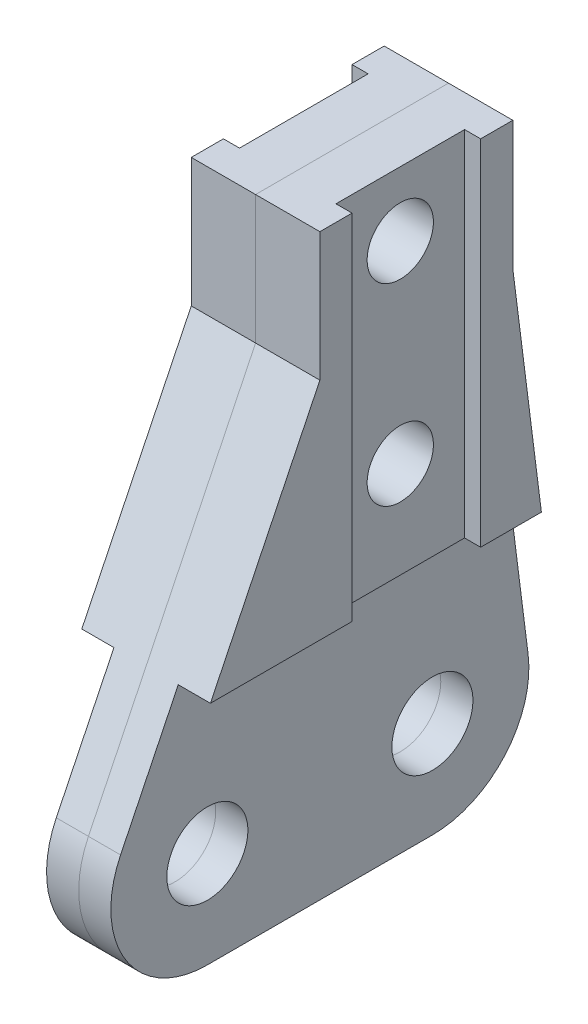
ISO-10303-21;
HEADER;
FILE_DESCRIPTION(('STEP AP214'),'2;1');
FILE_NAME('part.step','',(''),(''),'','','');
FILE_SCHEMA(('AUTOMOTIVE_DESIGN { 1 0 10303 214 1 1 1 1 }'));
ENDSEC;
DATA;
#1=APPLICATION_CONTEXT('core data for automotive mechanical design processes');
#2=APPLICATION_PROTOCOL_DEFINITION('international standard','automotive_design',2000,#1);
#3=PRODUCT_CONTEXT('',#1,'mechanical');
#4=PRODUCT('Part','Part','',(#3));
#5=PRODUCT_RELATED_PRODUCT_CATEGORY('part','',(#4));
#6=PRODUCT_DEFINITION_FORMATION('','',#4);
#7=PRODUCT_DEFINITION_CONTEXT('part definition',#1,'design');
#8=PRODUCT_DEFINITION('design','',#6,#7);
#9=PRODUCT_DEFINITION_SHAPE('','',#8);
#10=(LENGTH_UNIT() NAMED_UNIT(*) SI_UNIT(.MILLI.,.METRE.));
#11=(NAMED_UNIT(*) PLANE_ANGLE_UNIT() SI_UNIT($,.RADIAN.));
#12=(NAMED_UNIT(*) SI_UNIT($,.STERADIAN.) SOLID_ANGLE_UNIT());
#13=UNCERTAINTY_MEASURE_WITH_UNIT(LENGTH_MEASURE(1.E-05),#10,'distance_accuracy_value','');
#14=(GEOMETRIC_REPRESENTATION_CONTEXT(3) GLOBAL_UNCERTAINTY_ASSIGNED_CONTEXT((#13)) GLOBAL_UNIT_ASSIGNED_CONTEXT((#10,
#11,#12)) REPRESENTATION_CONTEXT('',''));
#15=CARTESIAN_POINT('',(0.,0.,0.));
#16=DIRECTION('',(0.,0.,1.));
#17=DIRECTION('',(1.,0.,0.));
#18=AXIS2_PLACEMENT_3D('',#15,#16,#17);
#19=CARTESIAN_POINT('',(-12.7,0.,0.));
#20=DIRECTION('',(-1.,0.,0.));
#21=DIRECTION('',(0.,0.,-1.));
#22=AXIS2_PLACEMENT_3D('',#19,#20,#21);
#23=PLANE('',#22);
#24=DIRECTION('',(0.,-1.,0.));
#25=VECTOR('',#24,1.);
#26=CARTESIAN_POINT('',(-12.7,0.,0.));
#27=LINE('',#26,#25);
#28=CARTESIAN_POINT('',(-12.7,60.3249999999986,0.));
#29=VERTEX_POINT('',#28);
#30=CARTESIAN_POINT('',(-12.7,-9.52500000000001,0.));
#31=VERTEX_POINT('',#30);
#32=EDGE_CURVE('E179',#29,#31,#27,.T.);
#33=ORIENTED_EDGE('',*,*,#32,.T.);
#34=DIRECTION('',(0.,0.,-1.));
#35=VECTOR('',#34,1.);
#36=CARTESIAN_POINT('',(-12.7,-9.52500000000001,0.));
#37=LINE('',#36,#35);
#38=CARTESIAN_POINT('',(-12.7,-9.52500000000001,27.9673826489299));
#39=VERTEX_POINT('',#38);
#40=EDGE_CURVE('E12',#39,#31,#37,.T.);
#41=ORIENTED_EDGE('',*,*,#40,.F.);
#42=DIRECTION('',(0.,-0.899290328705867,0.437352151813722));
#43=VECTOR('',#42,1.);
#44=CARTESIAN_POINT('',(-12.7,9.17784255482599,18.8716232759169));
#45=LINE('',#44,#43);
#46=CARTESIAN_POINT('',(-12.7,34.9249999999986,6.34999999999709));
#47=VERTEX_POINT('',#46);
#48=EDGE_CURVE('E224',#47,#39,#45,.T.);
#49=ORIENTED_EDGE('',*,*,#48,.F.);
#50=DIRECTION('',(0.,-1.,0.));
#51=VECTOR('',#50,1.);
#52=CARTESIAN_POINT('',(-12.7,0.,6.34999999999709));
#53=LINE('',#52,#51);
#54=CARTESIAN_POINT('',(-12.7,60.3249999999986,6.3499999999971));
#55=VERTEX_POINT('',#54);
#56=EDGE_CURVE('E221',#55,#47,#53,.T.);
#57=ORIENTED_EDGE('',*,*,#56,.F.);
#58=DIRECTION('',(0.,0.,-1.));
#59=VECTOR('',#58,1.);
#60=CARTESIAN_POINT('',(-12.7,60.3249999999986,0.));
#61=LINE('',#60,#59);
#62=EDGE_CURVE('E218',#55,#29,#61,.T.);
#63=ORIENTED_EDGE('',*,*,#62,.T.);
#64=EDGE_LOOP('',(#33,#41,#49,#57,#63));
#65=FACE_BOUND('',#64,.T.);
#66=ADVANCED_FACE('F54',(#65),#23,.T.);
#67=CARTESIAN_POINT('',(-12.7,4.52293344157861,-35.611315475034));
#68=DIRECTION('',(0.,0.125996158832205,-0.992030729342357));
#69=DIRECTION('',(0.,0.992030729342358,0.125996158832205));
#70=AXIS2_PLACEMENT_3D('',#67,#68,#69);
#71=PLANE('',#70);
#72=DIRECTION('',(0.,-0.992030729342358,-0.125996158832205));
#73=VECTOR('',#72,1.);
#74=CARTESIAN_POINT('',(-12.7,4.52293344157861,-35.611315475034));
#75=LINE('',#74,#73);
#76=CARTESIAN_POINT('',(-12.7,34.9249999999986,-31.7499999999969));
#77=VERTEX_POINT('',#76);
#78=CARTESIAN_POINT('',(-12.7,-9.52500000000001,-37.3955199364651));
#79=VERTEX_POINT('',#78);
#80=EDGE_CURVE('E211',#77,#79,#75,.T.);
#81=ORIENTED_EDGE('',*,*,#80,.F.);
#82=DIRECTION('',(1.,0.,0.));
#83=VECTOR('',#82,1.);
#84=CARTESIAN_POINT('',(-12.7,34.9249999999986,-31.7499999999969));
#85=LINE('',#84,#83);
#86=CARTESIAN_POINT('',(0.,34.9249999999986,-31.7499999999969));
#87=VERTEX_POINT('',#86);
#88=EDGE_CURVE('E265',#77,#87,#85,.T.);
#89=ORIENTED_EDGE('',*,*,#88,.T.);
#90=DIRECTION('',(0.,-0.992030729342358,-0.125996158832205));
#91=VECTOR('',#90,1.);
#92=CARTESIAN_POINT('',(0.,4.52293344157861,-35.611315475034));
#93=LINE('',#92,#91);
#94=CARTESIAN_POINT('',(0.,-38.8747731742469,-41.1231853939687));
#95=VERTEX_POINT('',#94);
#96=EDGE_CURVE('E232',#87,#95,#93,.T.);
#97=ORIENTED_EDGE('',*,*,#96,.T.);
#98=DIRECTION('',(1.,0.,0.));
#99=VECTOR('',#98,1.);
#100=CARTESIAN_POINT('',(-12.7,-38.8747731742469,-41.1231853939687));
#101=LINE('',#100,#99);
#102=CARTESIAN_POINT('',(-6.35,-38.8747731742469,-41.1231853939687));
#103=VERTEX_POINT('',#102);
#104=EDGE_CURVE('E268',#103,#95,#101,.T.);
#105=ORIENTED_EDGE('',*,*,#104,.F.);
#106=DIRECTION('',(0.,0.992030729342358,0.125996158832205));
#107=VECTOR('',#106,1.);
#108=CARTESIAN_POINT('',(-6.35,4.52293344157861,-35.611315475034));
#109=LINE('',#108,#107);
#110=CARTESIAN_POINT('',(-6.35,-9.52500000000001,-37.3955199364651));
#111=VERTEX_POINT('',#110);
#112=EDGE_CURVE('E204',#103,#111,#109,.T.);
#113=ORIENTED_EDGE('',*,*,#112,.T.);
#114=DIRECTION('',(1.,0.,0.));
#115=VECTOR('',#114,1.);
#116=CARTESIAN_POINT('',(-12.7,-9.52500000000001,-37.3955199364651));
#117=LINE('',#116,#115);
#118=EDGE_CURVE('E192',#79,#111,#117,.T.);
#119=ORIENTED_EDGE('',*,*,#118,.F.);
#120=EDGE_LOOP('',(#81,#89,#97,#105,#113,#119));
#121=FACE_BOUND('',#120,.T.);
#122=ADVANCED_FACE('F296',(#121),#71,.T.);
#123=CARTESIAN_POINT('',(-12.7,9.17784255482599,18.8716232759169));
#124=DIRECTION('',(0.,-0.437352151813722,-0.899290328705867));
#125=DIRECTION('',(0.,0.899290328705867,-0.437352151813722));
#126=AXIS2_PLACEMENT_3D('',#123,#124,#125);
#127=PLANE('',#126);
#128=DIRECTION('',(1.,0.,0.));
#129=VECTOR('',#128,1.);
#130=CARTESIAN_POINT('',(-12.7,-9.52500000000001,27.9673826489299));
#131=LINE('',#130,#129);
#132=CARTESIAN_POINT('',(-6.35,-9.52500000000002,27.9673826489299));
#133=VERTEX_POINT('',#132);
#134=EDGE_CURVE('E189',#39,#133,#131,.T.);
#135=ORIENTED_EDGE('',*,*,#134,.T.);
#136=DIRECTION('',(0.,0.899290328705867,-0.437352151813722));
#137=VECTOR('',#136,1.);
#138=CARTESIAN_POINT('',(-6.35,9.17784255482599,18.8716232759169));
#139=LINE('',#138,#137);
#140=CARTESIAN_POINT('',(-6.35,-32.94344150795,39.3564807618438));
#141=VERTEX_POINT('',#140);
#142=EDGE_CURVE('E196',#141,#133,#139,.T.);
#143=ORIENTED_EDGE('',*,*,#142,.F.);
#144=DIRECTION('',(1.,0.,0.));
#145=VECTOR('',#144,1.);
#146=CARTESIAN_POINT('',(-12.7,-32.94344150795,39.3564807618438));
#147=LINE('',#146,#145);
#148=CARTESIAN_POINT('',(0.,-32.94344150795,39.3564807618438));
#149=VERTEX_POINT('',#148);
#150=EDGE_CURVE('E253',#141,#149,#147,.T.);
#151=ORIENTED_EDGE('',*,*,#150,.T.);
#152=DIRECTION('',(0.,-0.899290328705867,0.437352151813722));
#153=VECTOR('',#152,1.);
#154=CARTESIAN_POINT('',(0.,9.17784255482599,18.8716232759169));
#155=LINE('',#154,#153);
#156=CARTESIAN_POINT('',(0.,34.9249999999986,6.34999999999709));
#157=VERTEX_POINT('',#156);
#158=EDGE_CURVE('E241',#157,#149,#155,.T.);
#159=ORIENTED_EDGE('',*,*,#158,.F.);
#160=DIRECTION('',(1.,0.,0.));
#161=VECTOR('',#160,1.);
#162=CARTESIAN_POINT('',(-12.7,34.9249999999986,6.34999999999709));
#163=LINE('',#162,#161);
#164=EDGE_CURVE('E256',#47,#157,#163,.T.);
#165=ORIENTED_EDGE('',*,*,#164,.F.);
#166=ORIENTED_EDGE('',*,*,#48,.T.);
#167=EDGE_LOOP('',(#135,#143,#151,#159,#165,#166));
#168=FACE_BOUND('',#167,.T.);
#169=ADVANCED_FACE('F313',(#168),#127,.F.);
#170=DIRECTION('',(0.,1.,0.));
#171=VECTOR('',#170,1.);
#172=CARTESIAN_POINT('',(-12.7,0.,-25.3999999999969));
#173=LINE('',#172,#171);
#174=CARTESIAN_POINT('',(-12.7,-9.52500000000001,-25.3999999999969));
#175=VERTEX_POINT('',#174);
#176=CARTESIAN_POINT('',(-12.7,60.3249999999986,-25.3999999999969));
#177=VERTEX_POINT('',#176);
#178=EDGE_CURVE('E170',#175,#177,#173,.T.);
#179=ORIENTED_EDGE('',*,*,#178,.T.);
#180=CARTESIAN_POINT('',(-12.7,60.3249999999986,-31.7499999999969));
#181=VERTEX_POINT('',#180);
#182=EDGE_CURVE('E217',#177,#181,#61,.T.);
#183=ORIENTED_EDGE('',*,*,#182,.T.);
#184=DIRECTION('',(0.,-1.,0.));
#185=VECTOR('',#184,1.);
#186=CARTESIAN_POINT('',(-12.7,0.,-31.7499999999969));
#187=LINE('',#186,#185);
#188=EDGE_CURVE('E214',#181,#77,#187,.T.);
#189=ORIENTED_EDGE('',*,*,#188,.T.);
#190=ORIENTED_EDGE('',*,*,#80,.T.);
#191=EDGE_CURVE('E63',#175,#79,#37,.T.);
#192=ORIENTED_EDGE('',*,*,#191,.F.);
#193=EDGE_LOOP('',(#179,#183,#189,#190,#192));
#194=FACE_BOUND('',#193,.T.);
#195=ADVANCED_FACE('F316',(#194),#23,.T.);
#196=CARTESIAN_POINT('',(-12.7,-60.3249999999968,0.));
#197=DIRECTION('',(0.,1.,0.));
#198=DIRECTION('',(0.,0.,1.));
#199=AXIS2_PLACEMENT_3D('',#196,#197,#198);
#200=PLANE('',#199);
#201=DIRECTION('',(1.,0.,0.));
#202=VECTOR('',#201,1.);
#203=CARTESIAN_POINT('',(-12.7,-60.3249999999968,-22.225));
#204=LINE('',#203,#202);
#205=CARTESIAN_POINT('',(-6.35,-60.3249999999968,-22.225));
#206=VERTEX_POINT('',#205);
#207=CARTESIAN_POINT('',(0.,-60.3249999999968,-22.225));
#208=VERTEX_POINT('',#207);
#209=EDGE_CURVE('E271',#206,#208,#204,.T.);
#210=ORIENTED_EDGE('',*,*,#209,.T.);
#211=DIRECTION('',(0.,0.,-1.));
#212=VECTOR('',#211,1.);
#213=CARTESIAN_POINT('',(0.,-60.3249999999968,0.));
#214=LINE('',#213,#212);
#215=CARTESIAN_POINT('',(0.,-60.3249999999968,22.225));
#216=VERTEX_POINT('',#215);
#217=EDGE_CURVE('E210',#216,#208,#214,.T.);
#218=ORIENTED_EDGE('',*,*,#217,.F.);
#219=DIRECTION('',(1.,0.,0.));
#220=VECTOR('',#219,1.);
#221=CARTESIAN_POINT('',(-12.7,-60.3249999999968,22.225));
#222=LINE('',#221,#220);
#223=CARTESIAN_POINT('',(-6.35,-60.3249999999968,22.225));
#224=VERTEX_POINT('',#223);
#225=EDGE_CURVE('E227',#224,#216,#222,.T.);
#226=ORIENTED_EDGE('',*,*,#225,.F.);
#227=DIRECTION('',(0.,0.,1.));
#228=VECTOR('',#227,1.);
#229=CARTESIAN_POINT('',(-6.35,-60.3249999999968,0.));
#230=LINE('',#229,#228);
#231=EDGE_CURVE('E199',#206,#224,#230,.T.);
#232=ORIENTED_EDGE('',*,*,#231,.F.);
#233=EDGE_LOOP('',(#210,#218,#226,#232));
#234=FACE_BOUND('',#233,.T.);
#235=ADVANCED_FACE('F56',(#234),#200,.F.);
#236=CARTESIAN_POINT('',(-12.7,-41.275,-22.2250000000001));
#237=DIRECTION('',(1.,0.,0.));
#238=DIRECTION('',(0.,0.,1.));
#239=AXIS2_PLACEMENT_3D('',#236,#237,#238);
#240=CYLINDRICAL_SURFACE('',#239,19.0499999999968);
#241=ORIENTED_EDGE('',*,*,#104,.T.);
#242=CARTESIAN_POINT('',(0.,-41.275,-22.2250000000001));
#243=DIRECTION('',(1.,0.,0.));
#244=DIRECTION('',(0.,0.,-1.));
#245=AXIS2_PLACEMENT_3D('',#242,#243,#244);
#246=CIRCLE('',#245,19.0499999999968);
#247=EDGE_CURVE('E230',#208,#95,#246,.T.);
#248=ORIENTED_EDGE('',*,*,#247,.F.);
#249=ORIENTED_EDGE('',*,*,#209,.F.);
#250=CARTESIAN_POINT('',(-6.35,-41.275,-22.2250000000001));
#251=DIRECTION('',(-1.,0.,0.));
#252=DIRECTION('',(0.,0.,1.));
#253=AXIS2_PLACEMENT_3D('',#250,#251,#252);
#254=CIRCLE('',#253,19.0499999999968);
#255=EDGE_CURVE('E202',#103,#206,#254,.T.);
#256=ORIENTED_EDGE('',*,*,#255,.F.);
#257=EDGE_LOOP('',(#241,#248,#249,#256));
#258=FACE_BOUND('',#257,.T.);
#259=ADVANCED_FACE('F279',(#258),#240,.T.);
#260=CARTESIAN_POINT('',(-12.7,0.,-31.7499999999969));
#261=DIRECTION('',(0.,0.,-1.));
#262=DIRECTION('',(1.,0.,0.));
#263=AXIS2_PLACEMENT_3D('',#260,#261,#262);
#264=PLANE('',#263);
#265=DIRECTION('',(0.,-1.,0.));
#266=VECTOR('',#265,1.);
#267=CARTESIAN_POINT('',(0.,0.,-31.7499999999969));
#268=LINE('',#267,#266);
#269=CARTESIAN_POINT('',(0.,60.3249999999986,-31.7499999999969));
#270=VERTEX_POINT('',#269);
#271=EDGE_CURVE('E235',#270,#87,#268,.T.);
#272=ORIENTED_EDGE('',*,*,#271,.T.);
#273=ORIENTED_EDGE('',*,*,#88,.F.);
#274=ORIENTED_EDGE('',*,*,#188,.F.);
#275=DIRECTION('',(1.,0.,0.));
#276=VECTOR('',#275,1.);
#277=CARTESIAN_POINT('',(-12.7,60.3249999999986,-31.7499999999969));
#278=LINE('',#277,#276);
#279=EDGE_CURVE('E262',#181,#270,#278,.T.);
#280=ORIENTED_EDGE('',*,*,#279,.T.);
#281=EDGE_LOOP('',(#272,#273,#274,#280));
#282=FACE_BOUND('',#281,.T.);
#283=ADVANCED_FACE('F301',(#282),#264,.T.);
#284=CARTESIAN_POINT('',(-12.7,60.3249999999986,0.));
#285=DIRECTION('',(0.,1.,0.));
#286=DIRECTION('',(0.,0.,1.));
#287=AXIS2_PLACEMENT_3D('',#284,#285,#286);
#288=PLANE('',#287);
#289=DIRECTION('',(-1.,0.,0.));
#290=VECTOR('',#289,1.);
#291=CARTESIAN_POINT('',(-9.525,60.3249999999986,0.));
#292=LINE('',#291,#290);
#293=CARTESIAN_POINT('',(-9.525,60.3249999999986,0.));
#294=VERTEX_POINT('',#293);
#295=EDGE_CURVE('E183',#294,#29,#292,.T.);
#296=ORIENTED_EDGE('',*,*,#295,.T.);
#297=ORIENTED_EDGE('',*,*,#62,.F.);
#298=DIRECTION('',(1.,0.,0.));
#299=VECTOR('',#298,1.);
#300=CARTESIAN_POINT('',(-12.7,60.3249999999986,6.3499999999971));
#301=LINE('',#300,#299);
#302=CARTESIAN_POINT('',(0.,60.3249999999986,6.3499999999971));
#303=VERTEX_POINT('',#302);
#304=EDGE_CURVE('E259',#55,#303,#301,.T.);
#305=ORIENTED_EDGE('',*,*,#304,.T.);
#306=DIRECTION('',(0.,0.,-1.));
#307=VECTOR('',#306,1.);
#308=CARTESIAN_POINT('',(0.,60.3249999999986,0.));
#309=LINE('',#308,#307);
#310=EDGE_CURVE('E237',#303,#270,#309,.T.);
#311=ORIENTED_EDGE('',*,*,#310,.T.);
#312=ORIENTED_EDGE('',*,*,#279,.F.);
#313=ORIENTED_EDGE('',*,*,#182,.F.);
#314=DIRECTION('',(-1.,0.,0.));
#315=VECTOR('',#314,1.);
#316=CARTESIAN_POINT('',(-9.525,60.3249999999986,-25.3999999999969));
#317=LINE('',#316,#315);
#318=CARTESIAN_POINT('',(-9.525,60.3249999999986,-25.3999999999969));
#319=VERTEX_POINT('',#318);
#320=EDGE_CURVE('E171',#319,#177,#317,.T.);
#321=ORIENTED_EDGE('',*,*,#320,.F.);
#322=DIRECTION('',(0.,0.,1.));
#323=VECTOR('',#322,1.);
#324=CARTESIAN_POINT('',(-9.525,60.3249999999986,0.));
#325=LINE('',#324,#323);
#326=EDGE_CURVE('E162',#319,#294,#325,.T.);
#327=ORIENTED_EDGE('',*,*,#326,.T.);
#328=EDGE_LOOP('',(#296,#297,#305,#311,#312,#313,#321,#327));
#329=FACE_BOUND('',#328,.T.);
#330=ADVANCED_FACE('F306',(#329),#288,.T.);
#331=CARTESIAN_POINT('',(-12.7,0.,6.34999999999709));
#332=DIRECTION('',(0.,0.,-1.));
#333=DIRECTION('',(0.,1.,0.));
#334=AXIS2_PLACEMENT_3D('',#331,#332,#333);
#335=PLANE('',#334);
#336=DIRECTION('',(0.,-1.,0.));
#337=VECTOR('',#336,1.);
#338=CARTESIAN_POINT('',(0.,0.,6.34999999999709));
#339=LINE('',#338,#337);
#340=EDGE_CURVE('E239',#303,#157,#339,.T.);
#341=ORIENTED_EDGE('',*,*,#340,.F.);
#342=ORIENTED_EDGE('',*,*,#304,.F.);
#343=ORIENTED_EDGE('',*,*,#56,.T.);
#344=ORIENTED_EDGE('',*,*,#164,.T.);
#345=EDGE_LOOP('',(#341,#342,#343,#344));
#346=FACE_BOUND('',#345,.T.);
#347=ADVANCED_FACE('F310',(#346),#335,.F.);
#348=CARTESIAN_POINT('',(-12.7,-41.275,22.225));
#349=DIRECTION('',(1.,0.,0.));
#350=DIRECTION('',(0.,0.,1.));
#351=AXIS2_PLACEMENT_3D('',#348,#349,#350);
#352=CYLINDRICAL_SURFACE('',#351,8.00099999999679);
#353=CARTESIAN_POINT('',(-6.35,-41.275,22.225));
#354=DIRECTION('',(-1.,0.,0.));
#355=DIRECTION('',(0.,0.,1.));
#356=AXIS2_PLACEMENT_3D('',#353,#354,#355);
#357=CIRCLE('',#356,8.00099999999679);
#358=CARTESIAN_POINT('',(-6.35,-41.275,30.2259999999968));
#359=VERTEX_POINT('',#358);
#360=EDGE_CURVE('E207',#359,#359,#357,.T.);
#361=ORIENTED_EDGE('',*,*,#360,.T.);
#362=EDGE_LOOP('',(#361));
#363=FACE_BOUND('',#362,.T.);
#364=CARTESIAN_POINT('',(0.,-41.275,22.225));
#365=DIRECTION('',(1.,0.,0.));
#366=DIRECTION('',(0.,0.,-1.));
#367=AXIS2_PLACEMENT_3D('',#364,#365,#366);
#368=CIRCLE('',#367,8.00099999999679);
#369=CARTESIAN_POINT('',(0.,-41.275,14.2240000000032));
#370=VERTEX_POINT('',#369);
#371=EDGE_CURVE('E246',#370,#370,#368,.T.);
#372=ORIENTED_EDGE('',*,*,#371,.T.);
#373=EDGE_LOOP('',(#372));
#374=FACE_BOUND('',#373,.T.);
#375=ADVANCED_FACE('F355',(#363,#374),#352,.F.);
#376=CARTESIAN_POINT('',(-12.7,-41.275,22.225));
#377=DIRECTION('',(1.,0.,0.));
#378=DIRECTION('',(0.,0.,1.));
#379=AXIS2_PLACEMENT_3D('',#376,#377,#378);
#380=CYLINDRICAL_SURFACE('',#379,19.0499999999968);
#381=ORIENTED_EDGE('',*,*,#225,.T.);
#382=CARTESIAN_POINT('',(0.,-41.275,22.225));
#383=DIRECTION('',(1.,0.,0.));
#384=DIRECTION('',(0.,0.,-1.));
#385=AXIS2_PLACEMENT_3D('',#382,#383,#384);
#386=CIRCLE('',#385,19.0499999999968);
#387=EDGE_CURVE('E244',#149,#216,#386,.T.);
#388=ORIENTED_EDGE('',*,*,#387,.F.);
#389=ORIENTED_EDGE('',*,*,#150,.F.);
#390=CARTESIAN_POINT('',(-6.35,-41.275,22.225));
#391=DIRECTION('',(-1.,0.,0.));
#392=DIRECTION('',(0.,0.,1.));
#393=AXIS2_PLACEMENT_3D('',#390,#391,#392);
#394=CIRCLE('',#393,19.0499999999968);
#395=EDGE_CURVE('E194',#224,#141,#394,.T.);
#396=ORIENTED_EDGE('',*,*,#395,.F.);
#397=EDGE_LOOP('',(#381,#388,#389,#396));
#398=FACE_BOUND('',#397,.T.);
#399=ADVANCED_FACE('F289',(#398),#380,.T.);
#400=CARTESIAN_POINT('',(-12.7,-41.275,-22.2250000000001));
#401=DIRECTION('',(1.,0.,0.));
#402=DIRECTION('',(0.,0.,1.));
#403=AXIS2_PLACEMENT_3D('',#400,#401,#402);
#404=CYLINDRICAL_SURFACE('',#403,8.00099999999679);
#405=CARTESIAN_POINT('',(-6.35,-41.275,-22.2250000000001));
#406=DIRECTION('',(-1.,0.,0.));
#407=DIRECTION('',(0.,0.,1.));
#408=AXIS2_PLACEMENT_3D('',#405,#406,#407);
#409=CIRCLE('',#408,8.00099999999679);
#410=CARTESIAN_POINT('',(-6.35,-41.275,-14.2240000000033));
#411=VERTEX_POINT('',#410);
#412=EDGE_CURVE('E58',#411,#411,#409,.T.);
#413=ORIENTED_EDGE('',*,*,#412,.T.);
#414=EDGE_LOOP('',(#413));
#415=FACE_BOUND('',#414,.T.);
#416=CARTESIAN_POINT('',(0.,-41.275,-22.2250000000001));
#417=DIRECTION('',(1.,0.,0.));
#418=DIRECTION('',(0.,0.,-1.));
#419=AXIS2_PLACEMENT_3D('',#416,#417,#418);
#420=CIRCLE('',#419,8.00099999999679);
#421=CARTESIAN_POINT('',(0.,-41.275,-30.2259999999968));
#422=VERTEX_POINT('',#421);
#423=EDGE_CURVE('E215',#422,#422,#420,.T.);
#424=ORIENTED_EDGE('',*,*,#423,.T.);
#425=EDGE_LOOP('',(#424));
#426=FACE_BOUND('',#425,.T.);
#427=ADVANCED_FACE('F348',(#415,#426),#404,.F.);
#428=CARTESIAN_POINT('',(0.,0.,0.));
#429=DIRECTION('',(-1.,0.,0.));
#430=DIRECTION('',(0.,0.,-1.));
#431=AXIS2_PLACEMENT_3D('',#428,#429,#430);
#432=PLANE('',#431);
#433=ORIENTED_EDGE('',*,*,#217,.T.);
#434=ORIENTED_EDGE('',*,*,#247,.T.);
#435=ORIENTED_EDGE('',*,*,#96,.F.);
#436=ORIENTED_EDGE('',*,*,#271,.F.);
#437=ORIENTED_EDGE('',*,*,#310,.F.);
#438=ORIENTED_EDGE('',*,*,#340,.T.);
#439=ORIENTED_EDGE('',*,*,#158,.T.);
#440=ORIENTED_EDGE('',*,*,#387,.T.);
#441=EDGE_LOOP('',(#433,#434,#435,#436,#437,#438,#439,#440));
#442=FACE_BOUND('',#441,.T.);
#443=ORIENTED_EDGE('',*,*,#371,.F.);
#444=EDGE_LOOP('',(#443));
#445=FACE_BOUND('',#444,.T.);
#446=ORIENTED_EDGE('',*,*,#423,.F.);
#447=EDGE_LOOP('',(#446));
#448=FACE_BOUND('',#447,.T.);
#449=ADVANCED_FACE('F284',(#442,#445,#448),#432,.F.);
#450=CARTESIAN_POINT('',(-6.35,-9.52500000000001,63.9630765571107));
#451=DIRECTION('',(0.,-1.,0.));
#452=DIRECTION('',(0.,0.,-1.));
#453=AXIS2_PLACEMENT_3D('',#450,#451,#452);
#454=PLANE('',#453);
#455=DIRECTION('',(-1.,0.,0.));
#456=VECTOR('',#455,1.);
#457=CARTESIAN_POINT('',(-9.525,-9.52500000000001,0.));
#458=LINE('',#457,#456);
#459=CARTESIAN_POINT('',(-9.525,-9.52500000000001,0.));
#460=VERTEX_POINT('',#459);
#461=EDGE_CURVE('E172',#460,#31,#458,.T.);
#462=ORIENTED_EDGE('',*,*,#461,.F.);
#463=DIRECTION('',(0.,0.,-1.));
#464=VECTOR('',#463,1.);
#465=CARTESIAN_POINT('',(-9.525,-9.52500000000001,0.));
#466=LINE('',#465,#464);
#467=CARTESIAN_POINT('',(-9.525,-9.52500000000001,-25.3999999999969));
#468=VERTEX_POINT('',#467);
#469=EDGE_CURVE('E159',#460,#468,#466,.T.);
#470=ORIENTED_EDGE('',*,*,#469,.T.);
#471=DIRECTION('',(-1.,0.,0.));
#472=VECTOR('',#471,1.);
#473=CARTESIAN_POINT('',(-9.525,-9.52500000000001,-25.3999999999969));
#474=LINE('',#473,#472);
#475=EDGE_CURVE('E167',#468,#175,#474,.T.);
#476=ORIENTED_EDGE('',*,*,#475,.T.);
#477=ORIENTED_EDGE('',*,*,#191,.T.);
#478=ORIENTED_EDGE('',*,*,#118,.T.);
#479=DIRECTION('',(0.,0.,-1.));
#480=VECTOR('',#479,1.);
#481=CARTESIAN_POINT('',(-6.35,-9.52500000000001,63.9630765571107));
#482=LINE('',#481,#480);
#483=EDGE_CURVE('E185',#133,#111,#482,.T.);
#484=ORIENTED_EDGE('',*,*,#483,.F.);
#485=ORIENTED_EDGE('',*,*,#134,.F.);
#486=ORIENTED_EDGE('',*,*,#40,.T.);
#487=EDGE_LOOP('',(#462,#470,#476,#477,#478,#484,#485,#486));
#488=FACE_BOUND('',#487,.T.);
#489=ADVANCED_FACE('F174',(#488),#454,.T.);
#490=CARTESIAN_POINT('',(-6.35,0.,0.));
#491=DIRECTION('',(1.,0.,0.));
#492=DIRECTION('',(0.,0.,1.));
#493=AXIS2_PLACEMENT_3D('',#490,#491,#492);
#494=PLANE('',#493);
#495=ORIENTED_EDGE('',*,*,#360,.F.);
#496=EDGE_LOOP('',(#495));
#497=FACE_BOUND('',#496,.T.);
#498=ORIENTED_EDGE('',*,*,#112,.F.);
#499=ORIENTED_EDGE('',*,*,#255,.T.);
#500=ORIENTED_EDGE('',*,*,#231,.T.);
#501=ORIENTED_EDGE('',*,*,#395,.T.);
#502=ORIENTED_EDGE('',*,*,#142,.T.);
#503=ORIENTED_EDGE('',*,*,#483,.T.);
#504=EDGE_LOOP('',(#498,#499,#500,#501,#502,#503));
#505=FACE_BOUND('',#504,.T.);
#506=ORIENTED_EDGE('',*,*,#412,.F.);
#507=EDGE_LOOP('',(#506));
#508=FACE_BOUND('',#507,.T.);
#509=ADVANCED_FACE('F292',(#497,#505,#508),#494,.F.);
#510=CARTESIAN_POINT('',(-9.525,0.,0.));
#511=DIRECTION('',(0.,0.,1.));
#512=DIRECTION('',(0.,-1.,0.));
#513=AXIS2_PLACEMENT_3D('',#510,#511,#512);
#514=PLANE('',#513);
#515=ORIENTED_EDGE('',*,*,#32,.F.);
#516=ORIENTED_EDGE('',*,*,#295,.F.);
#517=DIRECTION('',(0.,-1.,0.));
#518=VECTOR('',#517,1.);
#519=CARTESIAN_POINT('',(-9.525,0.,0.));
#520=LINE('',#519,#518);
#521=EDGE_CURVE('E70',#294,#460,#520,.T.);
#522=ORIENTED_EDGE('',*,*,#521,.T.);
#523=ORIENTED_EDGE('',*,*,#461,.T.);
#524=EDGE_LOOP('',(#515,#516,#522,#523));
#525=FACE_BOUND('',#524,.T.);
#526=ADVANCED_FACE('F333',(#525),#514,.F.);
#527=CARTESIAN_POINT('',(-9.525,0.,-25.3999999999969));
#528=DIRECTION('',(0.,0.,-1.));
#529=DIRECTION('',(1.,0.,0.));
#530=AXIS2_PLACEMENT_3D('',#527,#528,#529);
#531=PLANE('',#530);
#532=ORIENTED_EDGE('',*,*,#178,.F.);
#533=ORIENTED_EDGE('',*,*,#475,.F.);
#534=DIRECTION('',(0.,1.,0.));
#535=VECTOR('',#534,1.);
#536=CARTESIAN_POINT('',(-9.525,0.,-25.3999999999969));
#537=LINE('',#536,#535);
#538=EDGE_CURVE('E155',#468,#319,#537,.T.);
#539=ORIENTED_EDGE('',*,*,#538,.T.);
#540=ORIENTED_EDGE('',*,*,#320,.T.);
#541=EDGE_LOOP('',(#532,#533,#539,#540));
#542=FACE_BOUND('',#541,.T.);
#543=ADVANCED_FACE('F168',(#542),#531,.F.);
#544=CARTESIAN_POINT('',(-9.525,0.,0.));
#545=DIRECTION('',(-1.,0.,0.));
#546=DIRECTION('',(0.,0.,-1.));
#547=AXIS2_PLACEMENT_3D('',#544,#545,#546);
#548=PLANE('',#547);
#549=ORIENTED_EDGE('',*,*,#521,.F.);
#550=ORIENTED_EDGE('',*,*,#326,.F.);
#551=ORIENTED_EDGE('',*,*,#538,.F.);
#552=ORIENTED_EDGE('',*,*,#469,.F.);
#553=EDGE_LOOP('',(#549,#550,#551,#552));
#554=FACE_BOUND('',#553,.T.);
#555=ADVANCED_FACE('F157',(#554),#548,.T.);
#556=CLOSED_SHELL('',(#66,#122,#169,#195,#235,#259,#283,#330,#347,#375,#399,#427,#449,#489,#509,
#526,#543,#555));
#557=MANIFOLD_SOLID_BREP('B2_NOT_SHOWN',#556);
#558=CARTESIAN_POINT('',(12.7,0.,0.));
#559=DIRECTION('',(1.,0.,0.));
#560=DIRECTION('',(0.,0.,-1.));
#561=AXIS2_PLACEMENT_3D('',#558,#559,#560);
#562=PLANE('',#561);
#563=DIRECTION('',(0.,-1.,0.));
#564=VECTOR('',#563,1.);
#565=CARTESIAN_POINT('',(12.7,0.,0.));
#566=LINE('',#565,#564);
#567=CARTESIAN_POINT('',(12.7,60.3249999999986,0.));
#568=VERTEX_POINT('',#567);
#569=CARTESIAN_POINT('',(12.7,-9.52500000000001,0.));
#570=VERTEX_POINT('',#569);
#571=EDGE_CURVE('E760',#568,#570,#566,.T.);
#572=ORIENTED_EDGE('',*,*,#571,.F.);
#573=DIRECTION('',(0.,0.,-1.));
#574=VECTOR('',#573,1.);
#575=CARTESIAN_POINT('',(12.7,60.3249999999986,0.));
#576=LINE('',#575,#574);
#577=CARTESIAN_POINT('',(12.7,60.3249999999986,6.3499999999971));
#578=VERTEX_POINT('',#577);
#579=EDGE_CURVE('E676',#578,#568,#576,.T.);
#580=ORIENTED_EDGE('',*,*,#579,.F.);
#581=DIRECTION('',(0.,-1.,0.));
#582=VECTOR('',#581,1.);
#583=CARTESIAN_POINT('',(12.7,0.,6.34999999999709));
#584=LINE('',#583,#582);
#585=CARTESIAN_POINT('',(12.7,34.9249999999986,6.34999999999709));
#586=VERTEX_POINT('',#585);
#587=EDGE_CURVE('E680',#578,#586,#584,.T.);
#588=ORIENTED_EDGE('',*,*,#587,.T.);
#589=DIRECTION('',(0.,-0.899290328705867,0.437352151813722));
#590=VECTOR('',#589,1.);
#591=CARTESIAN_POINT('',(12.7,9.17784255482599,18.8716232759169));
#592=LINE('',#591,#590);
#593=CARTESIAN_POINT('',(12.7,-9.52500000000001,27.9673826489299));
#594=VERTEX_POINT('',#593);
#595=EDGE_CURVE('E683',#586,#594,#592,.T.);
#596=ORIENTED_EDGE('',*,*,#595,.T.);
#597=DIRECTION('',(0.,0.,-1.));
#598=VECTOR('',#597,1.);
#599=CARTESIAN_POINT('',(12.7,-9.52500000000001,0.));
#600=LINE('',#599,#598);
#601=EDGE_CURVE('E52',#594,#570,#600,.T.);
#602=ORIENTED_EDGE('',*,*,#601,.T.);
#603=EDGE_LOOP('',(#572,#580,#588,#596,#602));
#604=FACE_BOUND('',#603,.T.);
#605=ADVANCED_FACE('F497',(#604),#562,.T.);
#606=CARTESIAN_POINT('',(12.7,4.52293344157861,-35.611315475034));
#607=DIRECTION('',(0.,0.125996158832205,-0.992030729342357));
#608=DIRECTION('',(0.,0.992030729342358,0.125996158832205));
#609=AXIS2_PLACEMENT_3D('',#606,#607,#608);
#610=PLANE('',#609);
#611=DIRECTION('',(0.,-0.992030729342358,-0.125996158832205));
#612=VECTOR('',#611,1.);
#613=CARTESIAN_POINT('',(12.7,4.52293344157861,-35.611315475034));
#614=LINE('',#613,#612);
#615=CARTESIAN_POINT('',(12.7,34.9249999999986,-31.7499999999969));
#616=VERTEX_POINT('',#615);
#617=CARTESIAN_POINT('',(12.7,-9.52500000000001,-37.3955199364651));
#618=VERTEX_POINT('',#617);
#619=EDGE_CURVE('E666',#616,#618,#614,.T.);
#620=ORIENTED_EDGE('',*,*,#619,.T.);
#621=DIRECTION('',(-1.,0.,0.));
#622=VECTOR('',#621,1.);
#623=CARTESIAN_POINT('',(12.7,-9.52500000000001,-37.3955199364651));
#624=LINE('',#623,#622);
#625=CARTESIAN_POINT('',(6.35,-9.52500000000001,-37.3955199364651));
#626=VERTEX_POINT('',#625);
#627=EDGE_CURVE('E637',#618,#626,#624,.T.);
#628=ORIENTED_EDGE('',*,*,#627,.T.);
#629=DIRECTION('',(0.,0.992030729342358,0.125996158832205));
#630=VECTOR('',#629,1.);
#631=CARTESIAN_POINT('',(6.35,4.52293344157861,-35.611315475034));
#632=LINE('',#631,#630);
#633=CARTESIAN_POINT('',(6.35,-38.8747731742469,-41.1231853939687));
#634=VERTEX_POINT('',#633);
#635=EDGE_CURVE('E658',#634,#626,#632,.T.);
#636=ORIENTED_EDGE('',*,*,#635,.F.);
#637=DIRECTION('',(-1.,0.,0.));
#638=VECTOR('',#637,1.);
#639=CARTESIAN_POINT('',(12.7,-38.8747731742469,-41.1231853939687));
#640=LINE('',#639,#638);
#641=CARTESIAN_POINT('',(0.,-38.8747731742469,-41.1231853939687));
#642=VERTEX_POINT('',#641);
#643=EDGE_CURVE('E743',#634,#642,#640,.T.);
#644=ORIENTED_EDGE('',*,*,#643,.T.);
#645=DIRECTION('',(0.,-0.992030729342358,-0.125996158832205));
#646=VECTOR('',#645,1.);
#647=CARTESIAN_POINT('',(0.,4.52293344157861,-35.611315475034));
#648=LINE('',#647,#646);
#649=CARTESIAN_POINT('',(0.,34.9249999999986,-31.7499999999969));
#650=VERTEX_POINT('',#649);
#651=EDGE_CURVE('E695',#650,#642,#648,.T.);
#652=ORIENTED_EDGE('',*,*,#651,.F.);
#653=DIRECTION('',(-1.,0.,0.));
#654=VECTOR('',#653,1.);
#655=CARTESIAN_POINT('',(12.7,34.9249999999986,-31.7499999999969));
#656=LINE('',#655,#654);
#657=EDGE_CURVE('E740',#616,#650,#656,.T.);
#658=ORIENTED_EDGE('',*,*,#657,.F.);
#659=EDGE_LOOP('',(#620,#628,#636,#644,#652,#658));
#660=FACE_BOUND('',#659,.T.);
#661=ADVANCED_FACE('F806',(#660),#610,.T.);
#662=CARTESIAN_POINT('',(12.7,9.17784255482599,18.8716232759169));
#663=DIRECTION('',(0.,-0.437352151813722,-0.899290328705867));
#664=DIRECTION('',(0.,0.899290328705867,-0.437352151813722));
#665=AXIS2_PLACEMENT_3D('',#662,#663,#664);
#666=PLANE('',#665);
#667=DIRECTION('',(-1.,0.,0.));
#668=VECTOR('',#667,1.);
#669=CARTESIAN_POINT('',(12.7,-9.52500000000001,27.9673826489299));
#670=LINE('',#669,#668);
#671=CARTESIAN_POINT('',(6.35,-9.52500000000002,27.9673826489299));
#672=VERTEX_POINT('',#671);
#673=EDGE_CURVE('E634',#594,#672,#670,.T.);
#674=ORIENTED_EDGE('',*,*,#673,.F.);
#675=ORIENTED_EDGE('',*,*,#595,.F.);
#676=DIRECTION('',(-1.,0.,0.));
#677=VECTOR('',#676,1.);
#678=CARTESIAN_POINT('',(12.7,34.9249999999986,6.34999999999709));
#679=LINE('',#678,#677);
#680=CARTESIAN_POINT('',(0.,34.9249999999986,6.34999999999709));
#681=VERTEX_POINT('',#680);
#682=EDGE_CURVE('E730',#586,#681,#679,.T.);
#683=ORIENTED_EDGE('',*,*,#682,.T.);
#684=DIRECTION('',(0.,-0.899290328705867,0.437352151813722));
#685=VECTOR('',#684,1.);
#686=CARTESIAN_POINT('',(0.,9.17784255482599,18.8716232759169));
#687=LINE('',#686,#685);
#688=CARTESIAN_POINT('',(0.,-32.94344150795,39.3564807618438));
#689=VERTEX_POINT('',#688);
#690=EDGE_CURVE('E710',#681,#689,#687,.T.);
#691=ORIENTED_EDGE('',*,*,#690,.T.);
#692=DIRECTION('',(-1.,0.,0.));
#693=VECTOR('',#692,1.);
#694=CARTESIAN_POINT('',(12.7,-32.94344150795,39.3564807618438));
#695=LINE('',#694,#693);
#696=CARTESIAN_POINT('',(6.35,-32.94344150795,39.3564807618438));
#697=VERTEX_POINT('',#696);
#698=EDGE_CURVE('E727',#697,#689,#695,.T.);
#699=ORIENTED_EDGE('',*,*,#698,.F.);
#700=DIRECTION('',(0.,0.899290328705867,-0.437352151813722));
#701=VECTOR('',#700,1.);
#702=CARTESIAN_POINT('',(6.35,9.17784255482599,18.8716232759169));
#703=LINE('',#702,#701);
#704=EDGE_CURVE('E646',#697,#672,#703,.T.);
#705=ORIENTED_EDGE('',*,*,#704,.T.);
#706=EDGE_LOOP('',(#674,#675,#683,#691,#699,#705));
#707=FACE_BOUND('',#706,.T.);
#708=ADVANCED_FACE('F796',(#707),#666,.F.);
#709=DIRECTION('',(0.,1.,0.));
#710=VECTOR('',#709,1.);
#711=CARTESIAN_POINT('',(12.7,0.,-25.3999999999969));
#712=LINE('',#711,#710);
#713=CARTESIAN_POINT('',(12.7,-9.52500000000001,-25.3999999999969));
#714=VERTEX_POINT('',#713);
#715=CARTESIAN_POINT('',(12.7,60.3249999999986,-25.3999999999969));
#716=VERTEX_POINT('',#715);
#717=EDGE_CURVE('E771',#714,#716,#712,.T.);
#718=ORIENTED_EDGE('',*,*,#717,.F.);
#719=EDGE_CURVE('E507',#714,#618,#600,.T.);
#720=ORIENTED_EDGE('',*,*,#719,.T.);
#721=ORIENTED_EDGE('',*,*,#619,.F.);
#722=DIRECTION('',(0.,-1.,0.));
#723=VECTOR('',#722,1.);
#724=CARTESIAN_POINT('',(12.7,0.,-31.7499999999969));
#725=LINE('',#724,#723);
#726=CARTESIAN_POINT('',(12.7,60.3249999999986,-31.7499999999969));
#727=VERTEX_POINT('',#726);
#728=EDGE_CURVE('E670',#727,#616,#725,.T.);
#729=ORIENTED_EDGE('',*,*,#728,.F.);
#730=EDGE_CURVE('E675',#716,#727,#576,.T.);
#731=ORIENTED_EDGE('',*,*,#730,.F.);
#732=EDGE_LOOP('',(#718,#720,#721,#729,#731));
#733=FACE_BOUND('',#732,.T.);
#734=ADVANCED_FACE('F819',(#733),#562,.T.);
#735=CARTESIAN_POINT('',(12.7,-60.3249999999968,0.));
#736=DIRECTION('',(0.,1.,0.));
#737=DIRECTION('',(0.,0.,1.));
#738=AXIS2_PLACEMENT_3D('',#735,#736,#737);
#739=PLANE('',#738);
#740=DIRECTION('',(-1.,0.,0.));
#741=VECTOR('',#740,1.);
#742=CARTESIAN_POINT('',(12.7,-60.3249999999968,-22.225));
#743=LINE('',#742,#741);
#744=CARTESIAN_POINT('',(6.35,-60.3249999999968,-22.225));
#745=VERTEX_POINT('',#744);
#746=CARTESIAN_POINT('',(0.,-60.3249999999968,-22.225));
#747=VERTEX_POINT('',#746);
#748=EDGE_CURVE('E746',#745,#747,#743,.T.);
#749=ORIENTED_EDGE('',*,*,#748,.F.);
#750=DIRECTION('',(0.,0.,1.));
#751=VECTOR('',#750,1.);
#752=CARTESIAN_POINT('',(6.35,-60.3249999999968,0.));
#753=LINE('',#752,#751);
#754=CARTESIAN_POINT('',(6.35,-60.3249999999968,22.225));
#755=VERTEX_POINT('',#754);
#756=EDGE_CURVE('E650',#745,#755,#753,.T.);
#757=ORIENTED_EDGE('',*,*,#756,.T.);
#758=DIRECTION('',(-1.,0.,0.));
#759=VECTOR('',#758,1.);
#760=CARTESIAN_POINT('',(12.7,-60.3249999999968,22.225));
#761=LINE('',#760,#759);
#762=CARTESIAN_POINT('',(0.,-60.3249999999968,22.225));
#763=VERTEX_POINT('',#762);
#764=EDGE_CURVE('E687',#755,#763,#761,.T.);
#765=ORIENTED_EDGE('',*,*,#764,.T.);
#766=DIRECTION('',(0.,0.,-1.));
#767=VECTOR('',#766,1.);
#768=CARTESIAN_POINT('',(0.,-60.3249999999968,0.));
#769=LINE('',#768,#767);
#770=EDGE_CURVE('E665',#763,#747,#769,.T.);
#771=ORIENTED_EDGE('',*,*,#770,.T.);
#772=EDGE_LOOP('',(#749,#757,#765,#771));
#773=FACE_BOUND('',#772,.T.);
#774=ADVANCED_FACE('F499',(#773),#739,.F.);
#775=CARTESIAN_POINT('',(12.7,-41.275,-22.2250000000001));
#776=DIRECTION('',(-1.,0.,0.));
#777=DIRECTION('',(0.,0.,1.));
#778=AXIS2_PLACEMENT_3D('',#775,#776,#777);
#779=CYLINDRICAL_SURFACE('',#778,19.0499999999968);
#780=ORIENTED_EDGE('',*,*,#643,.F.);
#781=CARTESIAN_POINT('',(6.35,-41.275,-22.2250000000001));
#782=DIRECTION('',(-1.,0.,0.));
#783=DIRECTION('',(0.,0.,1.));
#784=AXIS2_PLACEMENT_3D('',#781,#782,#783);
#785=CIRCLE('',#784,19.0499999999968);
#786=EDGE_CURVE('E654',#634,#745,#785,.T.);
#787=ORIENTED_EDGE('',*,*,#786,.T.);
#788=ORIENTED_EDGE('',*,*,#748,.T.);
#789=CARTESIAN_POINT('',(0.,-41.275,-22.2250000000001));
#790=DIRECTION('',(1.,0.,0.));
#791=DIRECTION('',(0.,0.,-1.));
#792=AXIS2_PLACEMENT_3D('',#789,#790,#791);
#793=CIRCLE('',#792,19.0499999999968);
#794=EDGE_CURVE('E691',#747,#642,#793,.T.);
#795=ORIENTED_EDGE('',*,*,#794,.T.);
#796=EDGE_LOOP('',(#780,#787,#788,#795));
#797=FACE_BOUND('',#796,.T.);
#798=ADVANCED_FACE('F809',(#797),#779,.T.);
#799=CARTESIAN_POINT('',(12.7,0.,-31.7499999999969));
#800=DIRECTION('',(0.,0.,-1.));
#801=DIRECTION('',(-1.,0.,0.));
#802=AXIS2_PLACEMENT_3D('',#799,#800,#801);
#803=PLANE('',#802);
#804=DIRECTION('',(0.,-1.,0.));
#805=VECTOR('',#804,1.);
#806=CARTESIAN_POINT('',(0.,0.,-31.7499999999969));
#807=LINE('',#806,#805);
#808=CARTESIAN_POINT('',(0.,60.3249999999986,-31.7499999999969));
#809=VERTEX_POINT('',#808);
#810=EDGE_CURVE('E699',#809,#650,#807,.T.);
#811=ORIENTED_EDGE('',*,*,#810,.F.);
#812=DIRECTION('',(-1.,0.,0.));
#813=VECTOR('',#812,1.);
#814=CARTESIAN_POINT('',(12.7,60.3249999999986,-31.7499999999969));
#815=LINE('',#814,#813);
#816=EDGE_CURVE('E737',#727,#809,#815,.T.);
#817=ORIENTED_EDGE('',*,*,#816,.F.);
#818=ORIENTED_EDGE('',*,*,#728,.T.);
#819=ORIENTED_EDGE('',*,*,#657,.T.);
#820=EDGE_LOOP('',(#811,#817,#818,#819));
#821=FACE_BOUND('',#820,.T.);
#822=ADVANCED_FACE('F822',(#821),#803,.T.);
#823=CARTESIAN_POINT('',(12.7,60.3249999999986,0.));
#824=DIRECTION('',(0.,1.,0.));
#825=DIRECTION('',(0.,0.,1.));
#826=AXIS2_PLACEMENT_3D('',#823,#824,#825);
#827=PLANE('',#826);
#828=DIRECTION('',(1.,0.,0.));
#829=VECTOR('',#828,1.);
#830=CARTESIAN_POINT('',(9.525,60.3249999999986,0.));
#831=LINE('',#830,#829);
#832=CARTESIAN_POINT('',(9.525,60.3249999999986,0.));
#833=VERTEX_POINT('',#832);
#834=EDGE_CURVE('E625',#833,#568,#831,.T.);
#835=ORIENTED_EDGE('',*,*,#834,.F.);
#836=DIRECTION('',(0.,0.,1.));
#837=VECTOR('',#836,1.);
#838=CARTESIAN_POINT('',(9.525,60.3249999999986,0.));
#839=LINE('',#838,#837);
#840=CARTESIAN_POINT('',(9.525,60.3249999999986,-25.3999999999969));
#841=VERTEX_POINT('',#840);
#842=EDGE_CURVE('E610',#841,#833,#839,.T.);
#843=ORIENTED_EDGE('',*,*,#842,.F.);
#844=DIRECTION('',(1.,0.,0.));
#845=VECTOR('',#844,1.);
#846=CARTESIAN_POINT('',(9.525,60.3249999999986,-25.3999999999969));
#847=LINE('',#846,#845);
#848=EDGE_CURVE('E607',#841,#716,#847,.T.);
#849=ORIENTED_EDGE('',*,*,#848,.T.);
#850=ORIENTED_EDGE('',*,*,#730,.T.);
#851=ORIENTED_EDGE('',*,*,#816,.T.);
#852=DIRECTION('',(0.,0.,-1.));
#853=VECTOR('',#852,1.);
#854=CARTESIAN_POINT('',(0.,60.3249999999986,0.));
#855=LINE('',#854,#853);
#856=CARTESIAN_POINT('',(0.,60.3249999999986,6.3499999999971));
#857=VERTEX_POINT('',#856);
#858=EDGE_CURVE('E703',#857,#809,#855,.T.);
#859=ORIENTED_EDGE('',*,*,#858,.F.);
#860=DIRECTION('',(-1.,0.,0.));
#861=VECTOR('',#860,1.);
#862=CARTESIAN_POINT('',(12.7,60.3249999999986,6.3499999999971));
#863=LINE('',#862,#861);
#864=EDGE_CURVE('E734',#578,#857,#863,.T.);
#865=ORIENTED_EDGE('',*,*,#864,.F.);
#866=ORIENTED_EDGE('',*,*,#579,.T.);
#867=EDGE_LOOP('',(#835,#843,#849,#850,#851,#859,#865,#866));
#868=FACE_BOUND('',#867,.T.);
#869=ADVANCED_FACE('F786',(#868),#827,.T.);
#870=CARTESIAN_POINT('',(12.7,0.,6.34999999999709));
#871=DIRECTION('',(0.,0.,-1.));
#872=DIRECTION('',(0.,1.,0.));
#873=AXIS2_PLACEMENT_3D('',#870,#871,#872);
#874=PLANE('',#873);
#875=DIRECTION('',(0.,-1.,0.));
#876=VECTOR('',#875,1.);
#877=CARTESIAN_POINT('',(0.,0.,6.34999999999709));
#878=LINE('',#877,#876);
#879=EDGE_CURVE('E707',#857,#681,#878,.T.);
#880=ORIENTED_EDGE('',*,*,#879,.T.);
#881=ORIENTED_EDGE('',*,*,#682,.F.);
#882=ORIENTED_EDGE('',*,*,#587,.F.);
#883=ORIENTED_EDGE('',*,*,#864,.T.);
#884=EDGE_LOOP('',(#880,#881,#882,#883));
#885=FACE_BOUND('',#884,.T.);
#886=ADVANCED_FACE('F792',(#885),#874,.F.);
#887=CARTESIAN_POINT('',(12.7,-41.275,22.225));
#888=DIRECTION('',(-1.,0.,0.));
#889=DIRECTION('',(0.,0.,1.));
#890=AXIS2_PLACEMENT_3D('',#887,#888,#889);
#891=CYLINDRICAL_SURFACE('',#890,8.00099999999679);
#892=CARTESIAN_POINT('',(6.35,-41.275,22.225));
#893=DIRECTION('',(-1.,0.,0.));
#894=DIRECTION('',(0.,0.,1.));
#895=AXIS2_PLACEMENT_3D('',#892,#893,#894);
#896=CIRCLE('',#895,8.00099999999679);
#897=CARTESIAN_POINT('',(6.35,-41.275,30.2259999999968));
#898=VERTEX_POINT('',#897);
#899=EDGE_CURVE('E661',#898,#898,#896,.T.);
#900=ORIENTED_EDGE('',*,*,#899,.F.);
#901=EDGE_LOOP('',(#900));
#902=FACE_BOUND('',#901,.T.);
#903=CARTESIAN_POINT('',(0.,-41.275,22.225));
#904=DIRECTION('',(1.,0.,0.));
#905=DIRECTION('',(0.,0.,-1.));
#906=AXIS2_PLACEMENT_3D('',#903,#904,#905);
#907=CIRCLE('',#906,8.00099999999679);
#908=CARTESIAN_POINT('',(0.,-41.275,14.2240000000032));
#909=VERTEX_POINT('',#908);
#910=EDGE_CURVE('E718',#909,#909,#907,.T.);
#911=ORIENTED_EDGE('',*,*,#910,.F.);
#912=EDGE_LOOP('',(#911));
#913=FACE_BOUND('',#912,.T.);
#914=ADVANCED_FACE('F849',(#902,#913),#891,.F.);
#915=CARTESIAN_POINT('',(12.7,-41.275,22.225));
#916=DIRECTION('',(-1.,0.,0.));
#917=DIRECTION('',(0.,0.,1.));
#918=AXIS2_PLACEMENT_3D('',#915,#916,#917);
#919=CYLINDRICAL_SURFACE('',#918,19.0499999999968);
#920=ORIENTED_EDGE('',*,*,#764,.F.);
#921=CARTESIAN_POINT('',(6.35,-41.275,22.225));
#922=DIRECTION('',(-1.,0.,0.));
#923=DIRECTION('',(0.,0.,1.));
#924=AXIS2_PLACEMENT_3D('',#921,#922,#923);
#925=CIRCLE('',#924,19.0499999999968);
#926=EDGE_CURVE('E642',#755,#697,#925,.T.);
#927=ORIENTED_EDGE('',*,*,#926,.T.);
#928=ORIENTED_EDGE('',*,*,#698,.T.);
#929=CARTESIAN_POINT('',(0.,-41.275,22.225));
#930=DIRECTION('',(1.,0.,0.));
#931=DIRECTION('',(0.,0.,-1.));
#932=AXIS2_PLACEMENT_3D('',#929,#930,#931);
#933=CIRCLE('',#932,19.0499999999968);
#934=EDGE_CURVE('E714',#689,#763,#933,.T.);
#935=ORIENTED_EDGE('',*,*,#934,.T.);
#936=EDGE_LOOP('',(#920,#927,#928,#935));
#937=FACE_BOUND('',#936,.T.);
#938=ADVANCED_FACE('F828',(#937),#919,.T.);
#939=CARTESIAN_POINT('',(12.7,-41.275,-22.2250000000001));
#940=DIRECTION('',(-1.,0.,0.));
#941=DIRECTION('',(0.,0.,1.));
#942=AXIS2_PLACEMENT_3D('',#939,#940,#941);
#943=CYLINDRICAL_SURFACE('',#942,8.00099999999679);
#944=CARTESIAN_POINT('',(6.35,-41.275,-22.2250000000001));
#945=DIRECTION('',(-1.,0.,0.));
#946=DIRECTION('',(0.,0.,1.));
#947=AXIS2_PLACEMENT_3D('',#944,#945,#946);
#948=CIRCLE('',#947,8.00099999999679);
#949=CARTESIAN_POINT('',(6.35,-41.275,-14.2240000000033));
#950=VERTEX_POINT('',#949);
#951=EDGE_CURVE('E641',#950,#950,#948,.T.);
#952=ORIENTED_EDGE('',*,*,#951,.F.);
#953=EDGE_LOOP('',(#952));
#954=FACE_BOUND('',#953,.T.);
#955=CARTESIAN_POINT('',(0.,-41.275,-22.2250000000001));
#956=DIRECTION('',(1.,0.,0.));
#957=DIRECTION('',(0.,0.,-1.));
#958=AXIS2_PLACEMENT_3D('',#955,#956,#957);
#959=CIRCLE('',#958,8.00099999999679);
#960=CARTESIAN_POINT('',(0.,-41.275,-30.2259999999968));
#961=VERTEX_POINT('',#960);
#962=EDGE_CURVE('E671',#961,#961,#959,.T.);
#963=ORIENTED_EDGE('',*,*,#962,.F.);
#964=EDGE_LOOP('',(#963));
#965=FACE_BOUND('',#964,.T.);
#966=ADVANCED_FACE('F844',(#954,#965),#943,.F.);
#967=CARTESIAN_POINT('',(0.,0.,0.));
#968=DIRECTION('',(1.,0.,0.));
#969=DIRECTION('',(0.,0.,-1.));
#970=AXIS2_PLACEMENT_3D('',#967,#968,#969);
#971=PLANE('',#970);
#972=CARTESIAN_POINT('',(0.,47.6249999999986,-12.6999999999999));
#973=DIRECTION('',(-1.,0.,0.));
#974=DIRECTION('',(0.,0.,1.));
#975=AXIS2_PLACEMENT_3D('',#972,#973,#974);
#976=CIRCLE('',#975,6.5484375);
#977=CARTESIAN_POINT('',(0.,47.6249999999986,-6.15156249999993));
#978=VERTEX_POINT('',#977);
#979=EDGE_CURVE('E754',#978,#978,#976,.T.);
#980=ORIENTED_EDGE('',*,*,#979,.F.);
#981=EDGE_LOOP('',(#980));
#982=FACE_BOUND('',#981,.T.);
#983=CARTESIAN_POINT('',(0.,9.52499999999857,-12.6999999999999));
#984=DIRECTION('',(-1.,0.,0.));
#985=DIRECTION('',(0.,0.,1.));
#986=AXIS2_PLACEMENT_3D('',#983,#984,#985);
#987=CIRCLE('',#986,6.5484375);
#988=CARTESIAN_POINT('',(0.,9.52499999999857,-6.15156249999992));
#989=VERTEX_POINT('',#988);
#990=EDGE_CURVE('E762',#989,#989,#987,.T.);
#991=ORIENTED_EDGE('',*,*,#990,.F.);
#992=EDGE_LOOP('',(#991));
#993=FACE_BOUND('',#992,.T.);
#994=ORIENTED_EDGE('',*,*,#770,.F.);
#995=ORIENTED_EDGE('',*,*,#934,.F.);
#996=ORIENTED_EDGE('',*,*,#690,.F.);
#997=ORIENTED_EDGE('',*,*,#879,.F.);
#998=ORIENTED_EDGE('',*,*,#858,.T.);
#999=ORIENTED_EDGE('',*,*,#810,.T.);
#1000=ORIENTED_EDGE('',*,*,#651,.T.);
#1001=ORIENTED_EDGE('',*,*,#794,.F.);
#1002=EDGE_LOOP('',(#994,#995,#996,#997,#998,#999,#1000,#1001));
#1003=FACE_BOUND('',#1002,.T.);
#1004=ORIENTED_EDGE('',*,*,#910,.T.);
#1005=EDGE_LOOP('',(#1004));
#1006=FACE_BOUND('',#1005,.T.);
#1007=ORIENTED_EDGE('',*,*,#962,.T.);
#1008=EDGE_LOOP('',(#1007));
#1009=FACE_BOUND('',#1008,.T.);
#1010=ADVANCED_FACE('F814',(#982,#993,#1003,#1006,#1009),#971,.F.);
#1011=CARTESIAN_POINT('',(6.35,-9.52500000000001,63.9630765571107));
#1012=DIRECTION('',(0.,-1.,0.));
#1013=DIRECTION('',(0.,0.,-1.));
#1014=AXIS2_PLACEMENT_3D('',#1011,#1012,#1013);
#1015=PLANE('',#1014);
#1016=DIRECTION('',(1.,0.,0.));
#1017=VECTOR('',#1016,1.);
#1018=CARTESIAN_POINT('',(9.525,-9.52500000000001,0.));
#1019=LINE('',#1018,#1017);
#1020=CARTESIAN_POINT('',(9.525,-9.52500000000001,0.));
#1021=VERTEX_POINT('',#1020);
#1022=EDGE_CURVE('E621',#1021,#570,#1019,.T.);
#1023=ORIENTED_EDGE('',*,*,#1022,.T.);
#1024=ORIENTED_EDGE('',*,*,#601,.F.);
#1025=ORIENTED_EDGE('',*,*,#673,.T.);
#1026=DIRECTION('',(0.,0.,-1.));
#1027=VECTOR('',#1026,1.);
#1028=CARTESIAN_POINT('',(6.35,-9.52500000000001,63.9630765571107));
#1029=LINE('',#1028,#1027);
#1030=EDGE_CURVE('E630',#672,#626,#1029,.T.);
#1031=ORIENTED_EDGE('',*,*,#1030,.T.);
#1032=ORIENTED_EDGE('',*,*,#627,.F.);
#1033=ORIENTED_EDGE('',*,*,#719,.F.);
#1034=DIRECTION('',(1.,0.,0.));
#1035=VECTOR('',#1034,1.);
#1036=CARTESIAN_POINT('',(9.525,-9.52500000000001,-25.3999999999969));
#1037=LINE('',#1036,#1035);
#1038=CARTESIAN_POINT('',(9.525,-9.52500000000001,-25.3999999999969));
#1039=VERTEX_POINT('',#1038);
#1040=EDGE_CURVE('E605',#1039,#714,#1037,.T.);
#1041=ORIENTED_EDGE('',*,*,#1040,.F.);
#1042=DIRECTION('',(0.,0.,-1.));
#1043=VECTOR('',#1042,1.);
#1044=CARTESIAN_POINT('',(9.525,-9.52500000000001,0.));
#1045=LINE('',#1044,#1043);
#1046=EDGE_CURVE('E611',#1021,#1039,#1045,.T.);
#1047=ORIENTED_EDGE('',*,*,#1046,.F.);
#1048=EDGE_LOOP('',(#1023,#1024,#1025,#1031,#1032,#1033,#1041,#1047));
#1049=FACE_BOUND('',#1048,.T.);
#1050=ADVANCED_FACE('F619',(#1049),#1015,.T.);
#1051=CARTESIAN_POINT('',(6.35,0.,0.));
#1052=DIRECTION('',(-1.,0.,0.));
#1053=DIRECTION('',(0.,0.,1.));
#1054=AXIS2_PLACEMENT_3D('',#1051,#1052,#1053);
#1055=PLANE('',#1054);
#1056=ORIENTED_EDGE('',*,*,#899,.T.);
#1057=EDGE_LOOP('',(#1056));
#1058=FACE_BOUND('',#1057,.T.);
#1059=ORIENTED_EDGE('',*,*,#635,.T.);
#1060=ORIENTED_EDGE('',*,*,#1030,.F.);
#1061=ORIENTED_EDGE('',*,*,#704,.F.);
#1062=ORIENTED_EDGE('',*,*,#926,.F.);
#1063=ORIENTED_EDGE('',*,*,#756,.F.);
#1064=ORIENTED_EDGE('',*,*,#786,.F.);
#1065=EDGE_LOOP('',(#1059,#1060,#1061,#1062,#1063,#1064));
#1066=FACE_BOUND('',#1065,.T.);
#1067=ORIENTED_EDGE('',*,*,#951,.T.);
#1068=EDGE_LOOP('',(#1067));
#1069=FACE_BOUND('',#1068,.T.);
#1070=ADVANCED_FACE('F801',(#1058,#1066,#1069),#1055,.F.);
#1071=CARTESIAN_POINT('',(9.525,0.,0.));
#1072=DIRECTION('',(0.,0.,1.));
#1073=DIRECTION('',(0.,-1.,0.));
#1074=AXIS2_PLACEMENT_3D('',#1071,#1072,#1073);
#1075=PLANE('',#1074);
#1076=ORIENTED_EDGE('',*,*,#571,.T.);
#1077=ORIENTED_EDGE('',*,*,#1022,.F.);
#1078=DIRECTION('',(0.,-1.,0.));
#1079=VECTOR('',#1078,1.);
#1080=CARTESIAN_POINT('',(9.525,0.,0.));
#1081=LINE('',#1080,#1079);
#1082=EDGE_CURVE('E515',#833,#1021,#1081,.T.);
#1083=ORIENTED_EDGE('',*,*,#1082,.F.);
#1084=ORIENTED_EDGE('',*,*,#834,.T.);
#1085=EDGE_LOOP('',(#1076,#1077,#1083,#1084));
#1086=FACE_BOUND('',#1085,.T.);
#1087=ADVANCED_FACE('F782',(#1086),#1075,.F.);
#1088=CARTESIAN_POINT('',(9.525,0.,-25.3999999999969));
#1089=DIRECTION('',(0.,0.,-1.));
#1090=DIRECTION('',(-1.,0.,0.));
#1091=AXIS2_PLACEMENT_3D('',#1088,#1089,#1090);
#1092=PLANE('',#1091);
#1093=ORIENTED_EDGE('',*,*,#717,.T.);
#1094=ORIENTED_EDGE('',*,*,#848,.F.);
#1095=DIRECTION('',(0.,1.,0.));
#1096=VECTOR('',#1095,1.);
#1097=CARTESIAN_POINT('',(9.525,0.,-25.3999999999969));
#1098=LINE('',#1097,#1096);
#1099=EDGE_CURVE('E602',#1039,#841,#1098,.T.);
#1100=ORIENTED_EDGE('',*,*,#1099,.F.);
#1101=ORIENTED_EDGE('',*,*,#1040,.T.);
#1102=EDGE_LOOP('',(#1093,#1094,#1100,#1101));
#1103=FACE_BOUND('',#1102,.T.);
#1104=ADVANCED_FACE('F603',(#1103),#1092,.F.);
#1105=CARTESIAN_POINT('',(9.525,0.,0.));
#1106=DIRECTION('',(1.,0.,0.));
#1107=DIRECTION('',(0.,0.,-1.));
#1108=AXIS2_PLACEMENT_3D('',#1105,#1106,#1107);
#1109=PLANE('',#1108);
#1110=CARTESIAN_POINT('',(9.525,47.6249999999986,-12.6999999999999));
#1111=DIRECTION('',(1.,0.,0.));
#1112=DIRECTION('',(0.,0.,-1.));
#1113=AXIS2_PLACEMENT_3D('',#1110,#1111,#1112);
#1114=CIRCLE('',#1113,6.5484375);
#1115=CARTESIAN_POINT('',(9.525,47.6249999999986,-19.2484374999999));
#1116=VERTEX_POINT('',#1115);
#1117=EDGE_CURVE('E501',#1116,#1116,#1114,.T.);
#1118=ORIENTED_EDGE('',*,*,#1117,.F.);
#1119=EDGE_LOOP('',(#1118));
#1120=FACE_BOUND('',#1119,.T.);
#1121=CARTESIAN_POINT('',(9.525,9.52499999999857,-12.6999999999999));
#1122=DIRECTION('',(1.,0.,0.));
#1123=DIRECTION('',(0.,0.,-1.));
#1124=AXIS2_PLACEMENT_3D('',#1121,#1122,#1123);
#1125=CIRCLE('',#1124,6.5484375);
#1126=CARTESIAN_POINT('',(9.525,9.52499999999857,-19.2484374999999));
#1127=VERTEX_POINT('',#1126);
#1128=EDGE_CURVE('E751',#1127,#1127,#1125,.T.);
#1129=ORIENTED_EDGE('',*,*,#1128,.F.);
#1130=EDGE_LOOP('',(#1129));
#1131=FACE_BOUND('',#1130,.T.);
#1132=ORIENTED_EDGE('',*,*,#1082,.T.);
#1133=ORIENTED_EDGE('',*,*,#1046,.T.);
#1134=ORIENTED_EDGE('',*,*,#1099,.T.);
#1135=ORIENTED_EDGE('',*,*,#842,.T.);
#1136=EDGE_LOOP('',(#1132,#1133,#1134,#1135));
#1137=FACE_BOUND('',#1136,.T.);
#1138=ADVANCED_FACE('F614',(#1120,#1131,#1137),#1109,.T.);
#1139=CARTESIAN_POINT('',(12.7,9.52499999999857,-12.6999999999999));
#1140=DIRECTION('',(-1.,0.,0.));
#1141=DIRECTION('',(0.,0.,1.));
#1142=AXIS2_PLACEMENT_3D('',#1139,#1140,#1141);
#1143=CYLINDRICAL_SURFACE('',#1142,6.5484375);
#1144=ORIENTED_EDGE('',*,*,#1128,.T.);
#1145=EDGE_LOOP('',(#1144));
#1146=FACE_BOUND('',#1145,.T.);
#1147=ORIENTED_EDGE('',*,*,#990,.T.);
#1148=EDGE_LOOP('',(#1147));
#1149=FACE_BOUND('',#1148,.T.);
#1150=ADVANCED_FACE('F907',(#1146,#1149),#1143,.F.);
#1151=CARTESIAN_POINT('',(12.7,47.6249999999986,-12.6999999999999));
#1152=DIRECTION('',(-1.,0.,0.));
#1153=DIRECTION('',(0.,0.,1.));
#1154=AXIS2_PLACEMENT_3D('',#1151,#1152,#1153);
#1155=CYLINDRICAL_SURFACE('',#1154,6.5484375);
#1156=ORIENTED_EDGE('',*,*,#1117,.T.);
#1157=EDGE_LOOP('',(#1156));
#1158=FACE_BOUND('',#1157,.T.);
#1159=ORIENTED_EDGE('',*,*,#979,.T.);
#1160=EDGE_LOOP('',(#1159));
#1161=FACE_BOUND('',#1160,.T.);
#1162=ADVANCED_FACE('F914',(#1158,#1161),#1155,.F.);
#1163=CLOSED_SHELL('',(#605,#661,#708,#734,#774,#798,#822,#869,#886,#914,#938,#966,#1010,#1050,
#1070,#1087,#1104,#1138,#1150,#1162));
#1164=MANIFOLD_SOLID_BREP('B6',#1163);
#1165=ADVANCED_BREP_SHAPE_REPRESENTATION('',(#18,#557,#1164),#14);
#1166=SHAPE_DEFINITION_REPRESENTATION(#9,#1165);
ENDSEC;
END-ISO-10303-21;
